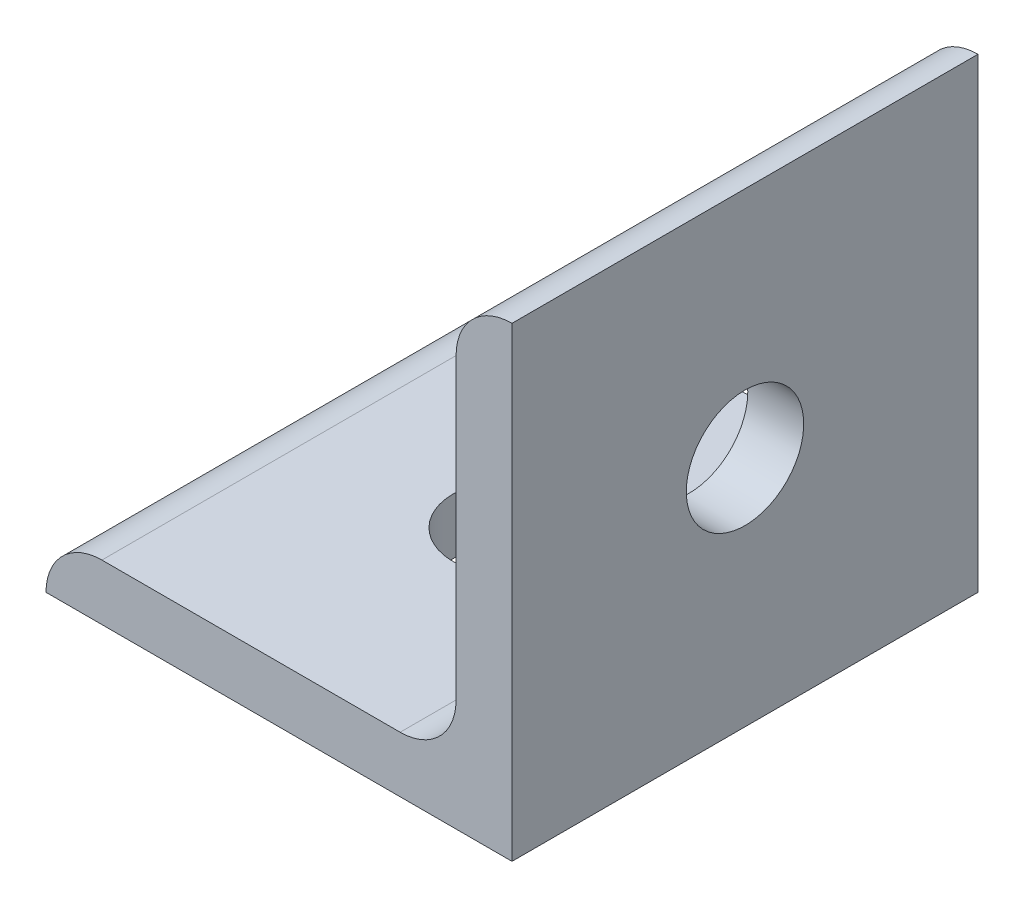
ISO-10303-21;
HEADER;
FILE_DESCRIPTION(('STEP AP214'),'2;1');
FILE_NAME('part.step','',(''),(''),'','','');
FILE_SCHEMA(('AUTOMOTIVE_DESIGN { 1 0 10303 214 1 1 1 1 }'));
ENDSEC;
DATA;
#1=APPLICATION_CONTEXT('core data for automotive mechanical design processes');
#2=APPLICATION_PROTOCOL_DEFINITION('international standard','automotive_design',2000,#1);
#3=PRODUCT_CONTEXT('',#1,'mechanical');
#4=PRODUCT('Part','Part','',(#3));
#5=PRODUCT_RELATED_PRODUCT_CATEGORY('part','',(#4));
#6=PRODUCT_DEFINITION_FORMATION('','',#4);
#7=PRODUCT_DEFINITION_CONTEXT('part definition',#1,'design');
#8=PRODUCT_DEFINITION('design','',#6,#7);
#9=PRODUCT_DEFINITION_SHAPE('','',#8);
#10=(LENGTH_UNIT() NAMED_UNIT(*) SI_UNIT(.MILLI.,.METRE.));
#11=(NAMED_UNIT(*) PLANE_ANGLE_UNIT() SI_UNIT($,.RADIAN.));
#12=(NAMED_UNIT(*) SI_UNIT($,.STERADIAN.) SOLID_ANGLE_UNIT());
#13=UNCERTAINTY_MEASURE_WITH_UNIT(LENGTH_MEASURE(1.E-05),#10,'distance_accuracy_value','');
#14=(GEOMETRIC_REPRESENTATION_CONTEXT(3) GLOBAL_UNCERTAINTY_ASSIGNED_CONTEXT((#13)) GLOBAL_UNIT_ASSIGNED_CONTEXT((#10,
#11,#12)) REPRESENTATION_CONTEXT('',''));
#15=CARTESIAN_POINT('',(0.,0.,0.));
#16=DIRECTION('',(0.,0.,1.));
#17=DIRECTION('',(1.,0.,0.));
#18=AXIS2_PLACEMENT_3D('',#15,#16,#17);
#19=CARTESIAN_POINT('',(22.3962655601659,-8.45892116182573,25.));
#20=DIRECTION('',(0.,0.,-1.));
#21=DIRECTION('',(-1.,0.,0.));
#22=AXIS2_PLACEMENT_3D('',#19,#20,#21);
#23=CYLINDRICAL_SURFACE('',#22,3.);
#24=CARTESIAN_POINT('',(22.3962655601659,-8.45892116182573,0.));
#25=DIRECTION('',(0.,0.,1.));
#26=DIRECTION('',(1.,0.,0.));
#27=AXIS2_PLACEMENT_3D('',#24,#25,#26);
#28=CIRCLE('',#27,3.);
#29=CARTESIAN_POINT('',(22.3962655601659,-5.45892116182573,0.));
#30=VERTEX_POINT('',#29);
#31=CARTESIAN_POINT('',(19.3962655601659,-8.45892116182573,0.));
#32=VERTEX_POINT('',#31);
#33=EDGE_CURVE('E123',#30,#32,#28,.T.);
#34=ORIENTED_EDGE('',*,*,#33,.T.);
#35=DIRECTION('',(0.,0.,-1.));
#36=VECTOR('',#35,1.);
#37=CARTESIAN_POINT('',(19.3962655601659,-8.45892116182573,25.));
#38=LINE('',#37,#36);
#39=CARTESIAN_POINT('',(19.3962655601659,-8.45892116182573,25.));
#40=VERTEX_POINT('',#39);
#41=EDGE_CURVE('E11',#40,#32,#38,.T.);
#42=ORIENTED_EDGE('',*,*,#41,.F.);
#43=CARTESIAN_POINT('',(22.3962655601659,-8.45892116182573,25.));
#44=DIRECTION('',(0.,0.,1.));
#45=DIRECTION('',(1.,0.,0.));
#46=AXIS2_PLACEMENT_3D('',#43,#44,#45);
#47=CIRCLE('',#46,3.);
#48=CARTESIAN_POINT('',(22.3962655601659,-5.45892116182573,25.));
#49=VERTEX_POINT('',#48);
#50=EDGE_CURVE('E136',#49,#40,#47,.T.);
#51=ORIENTED_EDGE('',*,*,#50,.F.);
#52=DIRECTION('',(0.,0.,-1.));
#53=VECTOR('',#52,1.);
#54=CARTESIAN_POINT('',(22.3962655601659,-5.45892116182573,25.));
#55=LINE('',#54,#53);
#56=EDGE_CURVE('E119',#49,#30,#55,.T.);
#57=ORIENTED_EDGE('',*,*,#56,.T.);
#58=EDGE_LOOP('',(#34,#42,#51,#57));
#59=FACE_BOUND('',#58,.T.);
#60=ADVANCED_FACE('F33',(#59),#23,.T.);
#61=CARTESIAN_POINT('',(19.3962655601659,-8.45892116182573,25.));
#62=DIRECTION('',(1.,0.,0.));
#63=DIRECTION('',(0.,0.,-1.));
#64=AXIS2_PLACEMENT_3D('',#61,#62,#63);
#65=PLANE('',#64);
#66=CARTESIAN_POINT('',(19.3962655601659,-17.9589211618257,12.5));
#67=DIRECTION('',(1.,0.,0.));
#68=DIRECTION('',(0.,0.,-1.));
#69=AXIS2_PLACEMENT_3D('',#66,#67,#68);
#70=CIRCLE('',#69,3.15);
#71=CARTESIAN_POINT('',(19.3962655601659,-17.9589211618257,9.35));
#72=VERTEX_POINT('',#71);
#73=EDGE_CURVE('E127',#72,#72,#70,.T.);
#74=ORIENTED_EDGE('',*,*,#73,.T.);
#75=EDGE_LOOP('',(#74));
#76=FACE_BOUND('',#75,.T.);
#77=DIRECTION('',(0.,-1.,0.));
#78=VECTOR('',#77,1.);
#79=CARTESIAN_POINT('',(19.3962655601659,-8.45892116182573,0.));
#80=LINE('',#79,#78);
#81=CARTESIAN_POINT('',(19.3962655601659,-24.4589211618257,0.));
#82=VERTEX_POINT('',#81);
#83=EDGE_CURVE('E126',#32,#82,#80,.T.);
#84=ORIENTED_EDGE('',*,*,#83,.T.);
#85=DIRECTION('',(0.,0.,-1.));
#86=VECTOR('',#85,1.);
#87=CARTESIAN_POINT('',(19.3962655601659,-24.4589211618257,25.));
#88=LINE('',#87,#86);
#89=CARTESIAN_POINT('',(19.3962655601659,-24.4589211618257,25.));
#90=VERTEX_POINT('',#89);
#91=EDGE_CURVE('E41',#90,#82,#88,.T.);
#92=ORIENTED_EDGE('',*,*,#91,.F.);
#93=DIRECTION('',(0.,-1.,0.));
#94=VECTOR('',#93,1.);
#95=CARTESIAN_POINT('',(19.3962655601659,-8.45892116182573,25.));
#96=LINE('',#95,#94);
#97=EDGE_CURVE('E89',#40,#90,#96,.T.);
#98=ORIENTED_EDGE('',*,*,#97,.F.);
#99=ORIENTED_EDGE('',*,*,#41,.T.);
#100=EDGE_LOOP('',(#84,#92,#98,#99));
#101=FACE_BOUND('',#100,.T.);
#102=ADVANCED_FACE('F185',(#76,#101),#65,.F.);
#103=CARTESIAN_POINT('',(16.3962655601659,-24.4589211618257,25.));
#104=DIRECTION('',(0.,0.,-1.));
#105=DIRECTION('',(-1.,0.,0.));
#106=AXIS2_PLACEMENT_3D('',#103,#104,#105);
#107=CYLINDRICAL_SURFACE('',#106,3.);
#108=CARTESIAN_POINT('',(16.3962655601659,-24.4589211618257,0.));
#109=DIRECTION('',(0.,0.,-1.));
#110=DIRECTION('',(1.,0.,0.));
#111=AXIS2_PLACEMENT_3D('',#108,#109,#110);
#112=CIRCLE('',#111,3.);
#113=CARTESIAN_POINT('',(16.3962655601659,-27.4589211618257,0.));
#114=VERTEX_POINT('',#113);
#115=EDGE_CURVE('E129',#82,#114,#112,.T.);
#116=ORIENTED_EDGE('',*,*,#115,.T.);
#117=DIRECTION('',(0.,0.,-1.));
#118=VECTOR('',#117,1.);
#119=CARTESIAN_POINT('',(16.3962655601659,-27.4589211618257,25.));
#120=LINE('',#119,#118);
#121=CARTESIAN_POINT('',(16.3962655601659,-27.4589211618257,25.));
#122=VERTEX_POINT('',#121);
#123=EDGE_CURVE('E140',#122,#114,#120,.T.);
#124=ORIENTED_EDGE('',*,*,#123,.F.);
#125=CARTESIAN_POINT('',(16.3962655601659,-24.4589211618257,25.));
#126=DIRECTION('',(0.,0.,-1.));
#127=DIRECTION('',(1.,0.,0.));
#128=AXIS2_PLACEMENT_3D('',#125,#126,#127);
#129=CIRCLE('',#128,3.);
#130=EDGE_CURVE('E148',#90,#122,#129,.T.);
#131=ORIENTED_EDGE('',*,*,#130,.F.);
#132=ORIENTED_EDGE('',*,*,#91,.T.);
#133=EDGE_LOOP('',(#116,#124,#131,#132));
#134=FACE_BOUND('',#133,.T.);
#135=ADVANCED_FACE('F146',(#134),#107,.F.);
#136=CARTESIAN_POINT('',(16.3962655601659,-27.4589211618257,25.));
#137=DIRECTION('',(0.,-1.,0.));
#138=DIRECTION('',(0.,0.,-1.));
#139=AXIS2_PLACEMENT_3D('',#136,#137,#138);
#140=PLANE('',#139);
#141=CARTESIAN_POINT('',(9.89626556016594,-27.4589211618257,12.5));
#142=DIRECTION('',(0.,-1.,0.));
#143=DIRECTION('',(0.,0.,-1.));
#144=AXIS2_PLACEMENT_3D('',#141,#142,#143);
#145=CIRCLE('',#144,3.15);
#146=CARTESIAN_POINT('',(9.89626556016594,-27.4589211618257,9.35));
#147=VERTEX_POINT('',#146);
#148=EDGE_CURVE('E164',#147,#147,#145,.T.);
#149=ORIENTED_EDGE('',*,*,#148,.T.);
#150=EDGE_LOOP('',(#149));
#151=FACE_BOUND('',#150,.T.);
#152=DIRECTION('',(-1.,0.,0.));
#153=VECTOR('',#152,1.);
#154=CARTESIAN_POINT('',(16.3962655601659,-27.4589211618257,0.));
#155=LINE('',#154,#153);
#156=CARTESIAN_POINT('',(0.396265560165939,-27.4589211618257,0.));
#157=VERTEX_POINT('',#156);
#158=EDGE_CURVE('E131',#114,#157,#155,.T.);
#159=ORIENTED_EDGE('',*,*,#158,.T.);
#160=DIRECTION('',(0.,0.,-1.));
#161=VECTOR('',#160,1.);
#162=CARTESIAN_POINT('',(0.396265560165939,-27.4589211618257,25.));
#163=LINE('',#162,#161);
#164=CARTESIAN_POINT('',(0.396265560165939,-27.4589211618257,25.));
#165=VERTEX_POINT('',#164);
#166=EDGE_CURVE('E114',#165,#157,#163,.T.);
#167=ORIENTED_EDGE('',*,*,#166,.F.);
#168=DIRECTION('',(-1.,0.,0.));
#169=VECTOR('',#168,1.);
#170=CARTESIAN_POINT('',(16.3962655601659,-27.4589211618257,25.));
#171=LINE('',#170,#169);
#172=EDGE_CURVE('E105',#122,#165,#171,.T.);
#173=ORIENTED_EDGE('',*,*,#172,.F.);
#174=ORIENTED_EDGE('',*,*,#123,.T.);
#175=EDGE_LOOP('',(#159,#167,#173,#174));
#176=FACE_BOUND('',#175,.T.);
#177=ADVANCED_FACE('F154',(#151,#176),#140,.F.);
#178=CARTESIAN_POINT('',(0.396265560165939,-30.4589211618257,25.));
#179=DIRECTION('',(0.,0.,-1.));
#180=DIRECTION('',(-1.,0.,0.));
#181=AXIS2_PLACEMENT_3D('',#178,#179,#180);
#182=CYLINDRICAL_SURFACE('',#181,3.);
#183=CARTESIAN_POINT('',(0.396265560165939,-30.4589211618257,0.));
#184=DIRECTION('',(0.,0.,1.));
#185=DIRECTION('',(1.,0.,0.));
#186=AXIS2_PLACEMENT_3D('',#183,#184,#185);
#187=CIRCLE('',#186,3.);
#188=CARTESIAN_POINT('',(-2.60373443983406,-30.4589211618257,0.));
#189=VERTEX_POINT('',#188);
#190=EDGE_CURVE('E113',#157,#189,#187,.T.);
#191=ORIENTED_EDGE('',*,*,#190,.T.);
#192=DIRECTION('',(0.,0.,-1.));
#193=VECTOR('',#192,1.);
#194=CARTESIAN_POINT('',(-2.60373443983406,-30.4589211618257,25.));
#195=LINE('',#194,#193);
#196=CARTESIAN_POINT('',(-2.60373443983406,-30.4589211618257,25.));
#197=VERTEX_POINT('',#196);
#198=EDGE_CURVE('E110',#197,#189,#195,.T.);
#199=ORIENTED_EDGE('',*,*,#198,.F.);
#200=CARTESIAN_POINT('',(0.396265560165939,-30.4589211618257,25.));
#201=DIRECTION('',(0.,0.,1.));
#202=DIRECTION('',(1.,0.,0.));
#203=AXIS2_PLACEMENT_3D('',#200,#201,#202);
#204=CIRCLE('',#203,3.);
#205=EDGE_CURVE('E99',#165,#197,#204,.T.);
#206=ORIENTED_EDGE('',*,*,#205,.F.);
#207=ORIENTED_EDGE('',*,*,#166,.T.);
#208=EDGE_LOOP('',(#191,#199,#206,#207));
#209=FACE_BOUND('',#208,.T.);
#210=ADVANCED_FACE('F111',(#209),#182,.T.);
#211=CARTESIAN_POINT('',(22.3962655601659,-30.4589211618257,25.));
#212=DIRECTION('',(0.,1.,0.));
#213=DIRECTION('',(0.,0.,1.));
#214=AXIS2_PLACEMENT_3D('',#211,#212,#213);
#215=PLANE('',#214);
#216=CARTESIAN_POINT('',(9.89626556016594,-30.4589211618257,12.5));
#217=DIRECTION('',(0.,-1.,0.));
#218=DIRECTION('',(0.,0.,-1.));
#219=AXIS2_PLACEMENT_3D('',#216,#217,#218);
#220=CIRCLE('',#219,3.15);
#221=CARTESIAN_POINT('',(9.89626556016594,-30.4589211618257,9.35));
#222=VERTEX_POINT('',#221);
#223=EDGE_CURVE('E167',#222,#222,#220,.T.);
#224=ORIENTED_EDGE('',*,*,#223,.F.);
#225=EDGE_LOOP('',(#224));
#226=FACE_BOUND('',#225,.T.);
#227=DIRECTION('',(1.,0.,0.));
#228=VECTOR('',#227,1.);
#229=CARTESIAN_POINT('',(22.3962655601659,-30.4589211618257,0.));
#230=LINE('',#229,#228);
#231=CARTESIAN_POINT('',(22.3962655601659,-30.4589211618257,0.));
#232=VERTEX_POINT('',#231);
#233=EDGE_CURVE('E75',#189,#232,#230,.T.);
#234=ORIENTED_EDGE('',*,*,#233,.T.);
#235=DIRECTION('',(0.,0.,-1.));
#236=VECTOR('',#235,1.);
#237=CARTESIAN_POINT('',(22.3962655601659,-30.4589211618257,25.));
#238=LINE('',#237,#236);
#239=CARTESIAN_POINT('',(22.3962655601659,-30.4589211618257,25.));
#240=VERTEX_POINT('',#239);
#241=EDGE_CURVE('E115',#240,#232,#238,.T.);
#242=ORIENTED_EDGE('',*,*,#241,.F.);
#243=DIRECTION('',(1.,0.,0.));
#244=VECTOR('',#243,1.);
#245=CARTESIAN_POINT('',(22.3962655601659,-30.4589211618257,25.));
#246=LINE('',#245,#244);
#247=EDGE_CURVE('E103',#197,#240,#246,.T.);
#248=ORIENTED_EDGE('',*,*,#247,.F.);
#249=ORIENTED_EDGE('',*,*,#198,.T.);
#250=EDGE_LOOP('',(#234,#242,#248,#249));
#251=FACE_BOUND('',#250,.T.);
#252=ADVANCED_FACE('F117',(#226,#251),#215,.F.);
#253=CARTESIAN_POINT('',(22.3962655601659,-5.45892116182573,25.));
#254=DIRECTION('',(-1.,0.,0.));
#255=DIRECTION('',(0.,-1.,0.));
#256=AXIS2_PLACEMENT_3D('',#253,#254,#255);
#257=PLANE('',#256);
#258=CARTESIAN_POINT('',(22.3962655601659,-17.9589211618257,12.5));
#259=DIRECTION('',(1.,0.,0.));
#260=DIRECTION('',(0.,1.,0.));
#261=AXIS2_PLACEMENT_3D('',#258,#259,#260);
#262=CIRCLE('',#261,3.15);
#263=CARTESIAN_POINT('',(22.3962655601659,-14.8089211618257,12.5));
#264=VERTEX_POINT('',#263);
#265=EDGE_CURVE('E161',#264,#264,#262,.T.);
#266=ORIENTED_EDGE('',*,*,#265,.F.);
#267=EDGE_LOOP('',(#266));
#268=FACE_BOUND('',#267,.T.);
#269=DIRECTION('',(0.,1.,0.));
#270=VECTOR('',#269,1.);
#271=CARTESIAN_POINT('',(22.3962655601659,-5.45892116182573,0.));
#272=LINE('',#271,#270);
#273=EDGE_CURVE('E81',#232,#30,#272,.T.);
#274=ORIENTED_EDGE('',*,*,#273,.T.);
#275=ORIENTED_EDGE('',*,*,#56,.F.);
#276=DIRECTION('',(0.,1.,0.));
#277=VECTOR('',#276,1.);
#278=CARTESIAN_POINT('',(22.3962655601659,-5.45892116182573,25.));
#279=LINE('',#278,#277);
#280=EDGE_CURVE('E49',#240,#49,#279,.T.);
#281=ORIENTED_EDGE('',*,*,#280,.F.);
#282=ORIENTED_EDGE('',*,*,#241,.T.);
#283=EDGE_LOOP('',(#274,#275,#281,#282));
#284=FACE_BOUND('',#283,.T.);
#285=ADVANCED_FACE('F175',(#268,#284),#257,.F.);
#286=CARTESIAN_POINT('',(22.3962655601659,-8.45892116182573,25.));
#287=DIRECTION('',(0.,0.,1.));
#288=DIRECTION('',(1.,0.,0.));
#289=AXIS2_PLACEMENT_3D('',#286,#287,#288);
#290=PLANE('',#289);
#291=ORIENTED_EDGE('',*,*,#50,.T.);
#292=ORIENTED_EDGE('',*,*,#97,.T.);
#293=ORIENTED_EDGE('',*,*,#130,.T.);
#294=ORIENTED_EDGE('',*,*,#172,.T.);
#295=ORIENTED_EDGE('',*,*,#205,.T.);
#296=ORIENTED_EDGE('',*,*,#247,.T.);
#297=ORIENTED_EDGE('',*,*,#280,.T.);
#298=EDGE_LOOP('',(#291,#292,#293,#294,#295,#296,#297));
#299=FACE_BOUND('',#298,.T.);
#300=ADVANCED_FACE('F101',(#299),#290,.T.);
#301=CARTESIAN_POINT('',(22.3962655601659,-8.45892116182573,0.));
#302=DIRECTION('',(0.,0.,1.));
#303=DIRECTION('',(1.,0.,0.));
#304=AXIS2_PLACEMENT_3D('',#301,#302,#303);
#305=PLANE('',#304);
#306=ORIENTED_EDGE('',*,*,#33,.F.);
#307=ORIENTED_EDGE('',*,*,#273,.F.);
#308=ORIENTED_EDGE('',*,*,#233,.F.);
#309=ORIENTED_EDGE('',*,*,#190,.F.);
#310=ORIENTED_EDGE('',*,*,#158,.F.);
#311=ORIENTED_EDGE('',*,*,#115,.F.);
#312=ORIENTED_EDGE('',*,*,#83,.F.);
#313=EDGE_LOOP('',(#306,#307,#308,#309,#310,#311,#312));
#314=FACE_BOUND('',#313,.T.);
#315=ADVANCED_FACE('F152',(#314),#305,.F.);
#316=CARTESIAN_POINT('',(-2.60373443983406,-17.9589211618257,12.5));
#317=DIRECTION('',(1.,0.,0.));
#318=DIRECTION('',(0.,1.,0.));
#319=AXIS2_PLACEMENT_3D('',#316,#317,#318);
#320=CYLINDRICAL_SURFACE('',#319,3.15);
#321=ORIENTED_EDGE('',*,*,#265,.T.);
#322=EDGE_LOOP('',(#321));
#323=FACE_BOUND('',#322,.T.);
#324=ORIENTED_EDGE('',*,*,#73,.F.);
#325=EDGE_LOOP('',(#324));
#326=FACE_BOUND('',#325,.T.);
#327=ADVANCED_FACE('F204',(#323,#326),#320,.F.);
#328=CARTESIAN_POINT('',(9.89626556016594,-5.45892116182573,12.5));
#329=DIRECTION('',(0.,-1.,0.));
#330=DIRECTION('',(0.,0.,-1.));
#331=AXIS2_PLACEMENT_3D('',#328,#329,#330);
#332=CYLINDRICAL_SURFACE('',#331,3.15);
#333=ORIENTED_EDGE('',*,*,#223,.T.);
#334=EDGE_LOOP('',(#333));
#335=FACE_BOUND('',#334,.T.);
#336=ORIENTED_EDGE('',*,*,#148,.F.);
#337=EDGE_LOOP('',(#336));
#338=FACE_BOUND('',#337,.T.);
#339=ADVANCED_FACE('F171',(#335,#338),#332,.F.);
#340=CLOSED_SHELL('',(#60,#102,#135,#177,#210,#252,#285,#300,#315,#327,#339));
#341=MANIFOLD_SOLID_BREP('B2',#340);
#342=ADVANCED_BREP_SHAPE_REPRESENTATION('',(#18,#341),#14);
#343=SHAPE_DEFINITION_REPRESENTATION(#9,#342);
ENDSEC;
END-ISO-10303-21;
